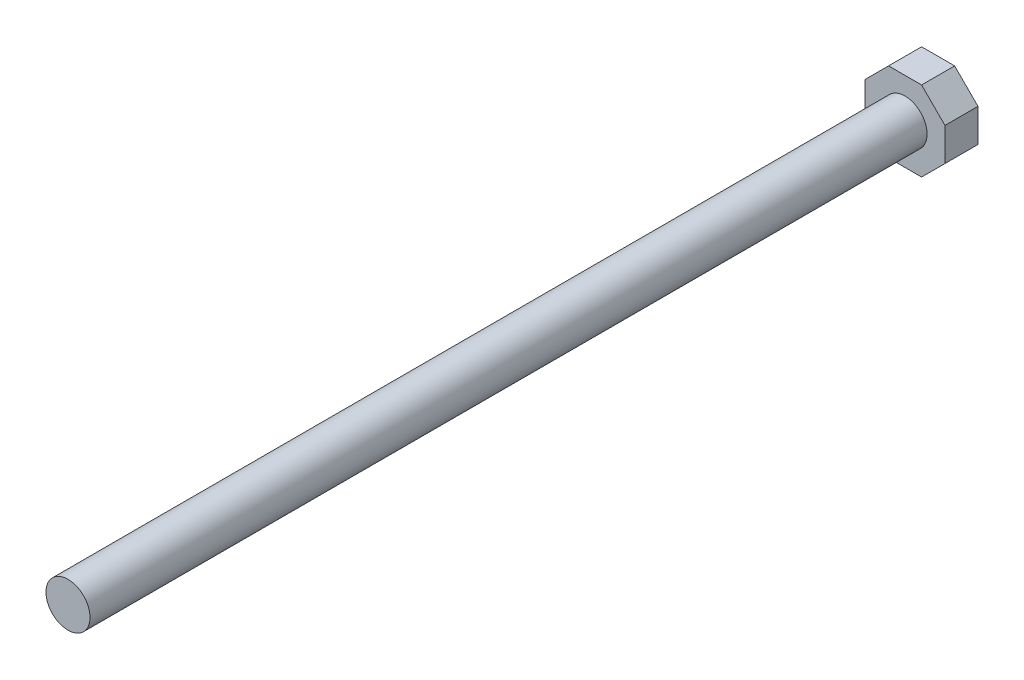
ISO-10303-21;
HEADER;
FILE_DESCRIPTION(('STEP AP214'),'2;1');
FILE_NAME('part.step','',(''),(''),'','','');
FILE_SCHEMA(('AUTOMOTIVE_DESIGN { 1 0 10303 214 1 1 1 1 }'));
ENDSEC;
DATA;
#1=APPLICATION_CONTEXT('core data for automotive mechanical design processes');
#2=APPLICATION_PROTOCOL_DEFINITION('international standard','automotive_design',2000,#1);
#3=PRODUCT_CONTEXT('',#1,'mechanical');
#4=PRODUCT('Part','Part','',(#3));
#5=PRODUCT_RELATED_PRODUCT_CATEGORY('part','',(#4));
#6=PRODUCT_DEFINITION_FORMATION('','',#4);
#7=PRODUCT_DEFINITION_CONTEXT('part definition',#1,'design');
#8=PRODUCT_DEFINITION('design','',#6,#7);
#9=PRODUCT_DEFINITION_SHAPE('','',#8);
#10=(LENGTH_UNIT() NAMED_UNIT(*) SI_UNIT(.MILLI.,.METRE.));
#11=(NAMED_UNIT(*) PLANE_ANGLE_UNIT() SI_UNIT($,.RADIAN.));
#12=(NAMED_UNIT(*) SI_UNIT($,.STERADIAN.) SOLID_ANGLE_UNIT());
#13=UNCERTAINTY_MEASURE_WITH_UNIT(LENGTH_MEASURE(1.E-05),#10,'distance_accuracy_value','');
#14=(GEOMETRIC_REPRESENTATION_CONTEXT(3) GLOBAL_UNCERTAINTY_ASSIGNED_CONTEXT((#13)) GLOBAL_UNIT_ASSIGNED_CONTEXT((#10,
#11,#12)) REPRESENTATION_CONTEXT('',''));
#15=CARTESIAN_POINT('',(0.,0.,0.));
#16=DIRECTION('',(0.,0.,1.));
#17=DIRECTION('',(1.,0.,0.));
#18=AXIS2_PLACEMENT_3D('',#15,#16,#17);
#19=CARTESIAN_POINT('',(-1.77703987317861,-2.71481784594583,3.));
#20=DIRECTION('',(1.,0.,0.));
#21=DIRECTION('',(0.,0.,-1.));
#22=AXIS2_PLACEMENT_3D('',#19,#20,#21);
#23=PLANE('',#22);
#24=DIRECTION('',(0.,-1.,0.));
#25=VECTOR('',#24,1.);
#26=CARTESIAN_POINT('',(-1.77703987317861,-2.71481784594583,0.));
#27=LINE('',#26,#25);
#28=CARTESIAN_POINT('',(-1.77703987317861,0.28518215405417,0.));
#29=VERTEX_POINT('',#28);
#30=CARTESIAN_POINT('',(-1.77703987317861,-2.71481784594583,0.));
#31=VERTEX_POINT('',#30);
#32=EDGE_CURVE('E131',#29,#31,#27,.T.);
#33=ORIENTED_EDGE('',*,*,#32,.T.);
#34=DIRECTION('',(0.,0.,-1.));
#35=VECTOR('',#34,1.);
#36=CARTESIAN_POINT('',(-1.77703987317861,-2.71481784594583,3.));
#37=LINE('',#36,#35);
#38=CARTESIAN_POINT('',(-1.77703987317861,-2.71481784594583,3.));
#39=VERTEX_POINT('',#38);
#40=EDGE_CURVE('E36',#39,#31,#37,.T.);
#41=ORIENTED_EDGE('',*,*,#40,.F.);
#42=DIRECTION('',(0.,-1.,0.));
#43=VECTOR('',#42,1.);
#44=CARTESIAN_POINT('',(-1.77703987317861,-2.71481784594583,3.));
#45=LINE('',#44,#43);
#46=CARTESIAN_POINT('',(-1.77703987317861,0.28518215405417,3.));
#47=VERTEX_POINT('',#46);
#48=EDGE_CURVE('E146',#47,#39,#45,.T.);
#49=ORIENTED_EDGE('',*,*,#48,.F.);
#50=DIRECTION('',(0.,0.,-1.));
#51=VECTOR('',#50,1.);
#52=CARTESIAN_POINT('',(-1.77703987317861,0.28518215405417,3.));
#53=LINE('',#52,#51);
#54=EDGE_CURVE('E127',#47,#29,#53,.T.);
#55=ORIENTED_EDGE('',*,*,#54,.T.);
#56=EDGE_LOOP('',(#33,#41,#49,#55));
#57=FACE_BOUND('',#56,.T.);
#58=ADVANCED_FACE('F33',(#57),#23,.F.);
#59=CARTESIAN_POINT('',(0.34428047038103,-4.83613818950547,3.));
#60=DIRECTION('',(0.707106781186547,0.707106781186547,0.));
#61=DIRECTION('',(-0.707106781186548,0.707106781186548,0.));
#62=AXIS2_PLACEMENT_3D('',#59,#60,#61);
#63=PLANE('',#62);
#64=DIRECTION('',(0.707106781186548,-0.707106781186548,0.));
#65=VECTOR('',#64,1.);
#66=CARTESIAN_POINT('',(0.34428047038103,-4.83613818950547,0.));
#67=LINE('',#66,#65);
#68=CARTESIAN_POINT('',(0.34428047038103,-4.83613818950547,0.));
#69=VERTEX_POINT('',#68);
#70=EDGE_CURVE('E134',#31,#69,#67,.T.);
#71=ORIENTED_EDGE('',*,*,#70,.T.);
#72=DIRECTION('',(0.,0.,-1.));
#73=VECTOR('',#72,1.);
#74=CARTESIAN_POINT('',(0.34428047038103,-4.83613818950547,3.));
#75=LINE('',#74,#73);
#76=CARTESIAN_POINT('',(0.34428047038103,-4.83613818950547,3.));
#77=VERTEX_POINT('',#76);
#78=EDGE_CURVE('E155',#77,#69,#75,.T.);
#79=ORIENTED_EDGE('',*,*,#78,.F.);
#80=DIRECTION('',(0.707106781186548,-0.707106781186548,0.));
#81=VECTOR('',#80,1.);
#82=CARTESIAN_POINT('',(0.34428047038103,-4.83613818950547,3.));
#83=LINE('',#82,#81);
#84=EDGE_CURVE('E94',#39,#77,#83,.T.);
#85=ORIENTED_EDGE('',*,*,#84,.F.);
#86=ORIENTED_EDGE('',*,*,#40,.T.);
#87=EDGE_LOOP('',(#71,#79,#85,#86));
#88=FACE_BOUND('',#87,.T.);
#89=ADVANCED_FACE('F161',(#88),#63,.F.);
#90=CARTESIAN_POINT('',(3.34428047038103,-4.83613818950547,3.));
#91=DIRECTION('',(0.,1.,0.));
#92=DIRECTION('',(0.,0.,1.));
#93=AXIS2_PLACEMENT_3D('',#90,#91,#92);
#94=PLANE('',#93);
#95=DIRECTION('',(1.,0.,0.));
#96=VECTOR('',#95,1.);
#97=CARTESIAN_POINT('',(3.34428047038103,-4.83613818950547,0.));
#98=LINE('',#97,#96);
#99=CARTESIAN_POINT('',(3.34428047038103,-4.83613818950547,0.));
#100=VERTEX_POINT('',#99);
#101=EDGE_CURVE('E137',#69,#100,#98,.T.);
#102=ORIENTED_EDGE('',*,*,#101,.T.);
#103=DIRECTION('',(0.,0.,-1.));
#104=VECTOR('',#103,1.);
#105=CARTESIAN_POINT('',(3.34428047038103,-4.83613818950547,3.));
#106=LINE('',#105,#104);
#107=CARTESIAN_POINT('',(3.34428047038103,-4.83613818950547,3.));
#108=VERTEX_POINT('',#107);
#109=EDGE_CURVE('E153',#108,#100,#106,.T.);
#110=ORIENTED_EDGE('',*,*,#109,.F.);
#111=DIRECTION('',(1.,0.,0.));
#112=VECTOR('',#111,1.);
#113=CARTESIAN_POINT('',(3.34428047038103,-4.83613818950547,3.));
#114=LINE('',#113,#112);
#115=EDGE_CURVE('E176',#77,#108,#114,.T.);
#116=ORIENTED_EDGE('',*,*,#115,.F.);
#117=ORIENTED_EDGE('',*,*,#78,.T.);
#118=EDGE_LOOP('',(#102,#110,#116,#117));
#119=FACE_BOUND('',#118,.T.);
#120=ADVANCED_FACE('F170',(#119),#94,.F.);
#121=CARTESIAN_POINT('',(5.46560081394067,-2.71481784594583,3.));
#122=DIRECTION('',(-0.707106781186548,0.707106781186547,0.));
#123=DIRECTION('',(-0.707106781186547,-0.707106781186548,0.));
#124=AXIS2_PLACEMENT_3D('',#121,#122,#123);
#125=PLANE('',#124);
#126=DIRECTION('',(0.707106781186547,0.707106781186548,0.));
#127=VECTOR('',#126,1.);
#128=CARTESIAN_POINT('',(5.46560081394067,-2.71481784594583,0.));
#129=LINE('',#128,#127);
#130=CARTESIAN_POINT('',(5.46560081394067,-2.71481784594583,0.));
#131=VERTEX_POINT('',#130);
#132=EDGE_CURVE('E139',#100,#131,#129,.T.);
#133=ORIENTED_EDGE('',*,*,#132,.T.);
#134=DIRECTION('',(0.,0.,-1.));
#135=VECTOR('',#134,1.);
#136=CARTESIAN_POINT('',(5.46560081394067,-2.71481784594583,3.));
#137=LINE('',#136,#135);
#138=CARTESIAN_POINT('',(5.46560081394067,-2.71481784594583,3.));
#139=VERTEX_POINT('',#138);
#140=EDGE_CURVE('E150',#139,#131,#137,.T.);
#141=ORIENTED_EDGE('',*,*,#140,.F.);
#142=DIRECTION('',(0.707106781186547,0.707106781186548,0.));
#143=VECTOR('',#142,1.);
#144=CARTESIAN_POINT('',(5.46560081394067,-2.71481784594583,3.));
#145=LINE('',#144,#143);
#146=EDGE_CURVE('E175',#108,#139,#145,.T.);
#147=ORIENTED_EDGE('',*,*,#146,.F.);
#148=ORIENTED_EDGE('',*,*,#109,.T.);
#149=EDGE_LOOP('',(#133,#141,#147,#148));
#150=FACE_BOUND('',#149,.T.);
#151=ADVANCED_FACE('F173',(#150),#125,.F.);
#152=CARTESIAN_POINT('',(5.46560081394067,0.285182154054171,3.));
#153=DIRECTION('',(-1.,0.,0.));
#154=DIRECTION('',(0.,0.,1.));
#155=AXIS2_PLACEMENT_3D('',#152,#153,#154);
#156=PLANE('',#155);
#157=DIRECTION('',(0.,1.,0.));
#158=VECTOR('',#157,1.);
#159=CARTESIAN_POINT('',(5.46560081394067,0.285182154054171,0.));
#160=LINE('',#159,#158);
#161=CARTESIAN_POINT('',(5.46560081394067,0.285182154054171,0.));
#162=VERTEX_POINT('',#161);
#163=EDGE_CURVE('E141',#131,#162,#160,.T.);
#164=ORIENTED_EDGE('',*,*,#163,.T.);
#165=DIRECTION('',(0.,0.,-1.));
#166=VECTOR('',#165,1.);
#167=CARTESIAN_POINT('',(5.46560081394067,0.285182154054171,3.));
#168=LINE('',#167,#166);
#169=CARTESIAN_POINT('',(5.46560081394067,0.285182154054171,3.));
#170=VERTEX_POINT('',#169);
#171=EDGE_CURVE('E122',#170,#162,#168,.T.);
#172=ORIENTED_EDGE('',*,*,#171,.F.);
#173=DIRECTION('',(0.,1.,0.));
#174=VECTOR('',#173,1.);
#175=CARTESIAN_POINT('',(5.46560081394067,0.285182154054171,3.));
#176=LINE('',#175,#174);
#177=EDGE_CURVE('E113',#139,#170,#176,.T.);
#178=ORIENTED_EDGE('',*,*,#177,.F.);
#179=ORIENTED_EDGE('',*,*,#140,.T.);
#180=EDGE_LOOP('',(#164,#172,#178,#179));
#181=FACE_BOUND('',#180,.T.);
#182=ADVANCED_FACE('F213',(#181),#156,.F.);
#183=CARTESIAN_POINT('',(3.34428047038103,2.40650249761381,3.));
#184=DIRECTION('',(-0.707106781186548,-0.707106781186547,0.));
#185=DIRECTION('',(0.707106781186547,-0.707106781186548,0.));
#186=AXIS2_PLACEMENT_3D('',#183,#184,#185);
#187=PLANE('',#186);
#188=DIRECTION('',(-0.707106781186547,0.707106781186548,0.));
#189=VECTOR('',#188,1.);
#190=CARTESIAN_POINT('',(3.34428047038103,2.40650249761381,0.));
#191=LINE('',#190,#189);
#192=CARTESIAN_POINT('',(3.34428047038103,2.40650249761381,0.));
#193=VERTEX_POINT('',#192);
#194=EDGE_CURVE('E121',#162,#193,#191,.T.);
#195=ORIENTED_EDGE('',*,*,#194,.T.);
#196=DIRECTION('',(0.,0.,-1.));
#197=VECTOR('',#196,1.);
#198=CARTESIAN_POINT('',(3.34428047038103,2.40650249761381,3.));
#199=LINE('',#198,#197);
#200=CARTESIAN_POINT('',(3.34428047038103,2.40650249761381,3.));
#201=VERTEX_POINT('',#200);
#202=EDGE_CURVE('E118',#201,#193,#199,.T.);
#203=ORIENTED_EDGE('',*,*,#202,.F.);
#204=DIRECTION('',(-0.707106781186547,0.707106781186548,0.));
#205=VECTOR('',#204,1.);
#206=CARTESIAN_POINT('',(3.34428047038103,2.40650249761381,3.));
#207=LINE('',#206,#205);
#208=EDGE_CURVE('E107',#170,#201,#207,.T.);
#209=ORIENTED_EDGE('',*,*,#208,.F.);
#210=ORIENTED_EDGE('',*,*,#171,.T.);
#211=EDGE_LOOP('',(#195,#203,#209,#210));
#212=FACE_BOUND('',#211,.T.);
#213=ADVANCED_FACE('F119',(#212),#187,.F.);
#214=CARTESIAN_POINT('',(0.34428047038103,2.40650249761381,3.));
#215=DIRECTION('',(0.,-1.,0.));
#216=DIRECTION('',(0.,0.,-1.));
#217=AXIS2_PLACEMENT_3D('',#214,#215,#216);
#218=PLANE('',#217);
#219=DIRECTION('',(-1.,0.,0.));
#220=VECTOR('',#219,1.);
#221=CARTESIAN_POINT('',(0.34428047038103,2.40650249761381,0.));
#222=LINE('',#221,#220);
#223=CARTESIAN_POINT('',(0.34428047038103,2.40650249761381,0.));
#224=VERTEX_POINT('',#223);
#225=EDGE_CURVE('E79',#193,#224,#222,.T.);
#226=ORIENTED_EDGE('',*,*,#225,.T.);
#227=DIRECTION('',(0.,0.,-1.));
#228=VECTOR('',#227,1.);
#229=CARTESIAN_POINT('',(0.34428047038103,2.40650249761381,3.));
#230=LINE('',#229,#228);
#231=CARTESIAN_POINT('',(0.34428047038103,2.40650249761381,3.));
#232=VERTEX_POINT('',#231);
#233=EDGE_CURVE('E123',#232,#224,#230,.T.);
#234=ORIENTED_EDGE('',*,*,#233,.F.);
#235=DIRECTION('',(-1.,0.,0.));
#236=VECTOR('',#235,1.);
#237=CARTESIAN_POINT('',(0.34428047038103,2.40650249761381,3.));
#238=LINE('',#237,#236);
#239=EDGE_CURVE('E111',#201,#232,#238,.T.);
#240=ORIENTED_EDGE('',*,*,#239,.F.);
#241=ORIENTED_EDGE('',*,*,#202,.T.);
#242=EDGE_LOOP('',(#226,#234,#240,#241));
#243=FACE_BOUND('',#242,.T.);
#244=ADVANCED_FACE('F125',(#243),#218,.F.);
#245=CARTESIAN_POINT('',(-1.77703987317861,0.28518215405417,3.));
#246=DIRECTION('',(0.707106781186548,-0.707106781186547,0.));
#247=DIRECTION('',(0.707106781186547,0.707106781186548,0.));
#248=AXIS2_PLACEMENT_3D('',#245,#246,#247);
#249=PLANE('',#248);
#250=DIRECTION('',(-0.707106781186547,-0.707106781186548,0.));
#251=VECTOR('',#250,1.);
#252=CARTESIAN_POINT('',(-1.77703987317861,0.28518215405417,0.));
#253=LINE('',#252,#251);
#254=EDGE_CURVE('E85',#224,#29,#253,.T.);
#255=ORIENTED_EDGE('',*,*,#254,.T.);
#256=ORIENTED_EDGE('',*,*,#54,.F.);
#257=DIRECTION('',(-0.707106781186547,-0.707106781186548,0.));
#258=VECTOR('',#257,1.);
#259=CARTESIAN_POINT('',(-1.77703987317861,0.28518215405417,3.));
#260=LINE('',#259,#258);
#261=EDGE_CURVE('E50',#232,#47,#260,.T.);
#262=ORIENTED_EDGE('',*,*,#261,.F.);
#263=ORIENTED_EDGE('',*,*,#233,.T.);
#264=EDGE_LOOP('',(#255,#256,#262,#263));
#265=FACE_BOUND('',#264,.T.);
#266=ADVANCED_FACE('F194',(#265),#249,.F.);
#267=CARTESIAN_POINT('',(0.,0.,3.));
#268=DIRECTION('',(0.,0.,-1.));
#269=DIRECTION('',(-1.,0.,0.));
#270=AXIS2_PLACEMENT_3D('',#267,#268,#269);
#271=PLANE('',#270);
#272=CARTESIAN_POINT('',(1.84428047038103,-1.21481784594583,3.));
#273=DIRECTION('',(0.,0.,1.));
#274=DIRECTION('',(1.,0.,0.));
#275=AXIS2_PLACEMENT_3D('',#272,#273,#274);
#276=CIRCLE('',#275,2.);
#277=CARTESIAN_POINT('',(3.84428047038103,-1.21481784594583,3.));
#278=VERTEX_POINT('',#277);
#279=EDGE_CURVE('E11',#278,#278,#276,.T.);
#280=ORIENTED_EDGE('',*,*,#279,.F.);
#281=EDGE_LOOP('',(#280));
#282=FACE_BOUND('',#281,.T.);
#283=ORIENTED_EDGE('',*,*,#48,.T.);
#284=ORIENTED_EDGE('',*,*,#84,.T.);
#285=ORIENTED_EDGE('',*,*,#115,.T.);
#286=ORIENTED_EDGE('',*,*,#146,.T.);
#287=ORIENTED_EDGE('',*,*,#177,.T.);
#288=ORIENTED_EDGE('',*,*,#208,.T.);
#289=ORIENTED_EDGE('',*,*,#239,.T.);
#290=ORIENTED_EDGE('',*,*,#261,.T.);
#291=EDGE_LOOP('',(#283,#284,#285,#286,#287,#288,#289,#290));
#292=FACE_BOUND('',#291,.T.);
#293=ADVANCED_FACE('F109',(#282,#292),#271,.F.);
#294=CARTESIAN_POINT('',(0.,0.,0.));
#295=DIRECTION('',(0.,0.,-1.));
#296=DIRECTION('',(-1.,0.,0.));
#297=AXIS2_PLACEMENT_3D('',#294,#295,#296);
#298=PLANE('',#297);
#299=ORIENTED_EDGE('',*,*,#32,.F.);
#300=ORIENTED_EDGE('',*,*,#254,.F.);
#301=ORIENTED_EDGE('',*,*,#225,.F.);
#302=ORIENTED_EDGE('',*,*,#194,.F.);
#303=ORIENTED_EDGE('',*,*,#163,.F.);
#304=ORIENTED_EDGE('',*,*,#132,.F.);
#305=ORIENTED_EDGE('',*,*,#101,.F.);
#306=ORIENTED_EDGE('',*,*,#70,.F.);
#307=EDGE_LOOP('',(#299,#300,#301,#302,#303,#304,#305,#306));
#308=FACE_BOUND('',#307,.T.);
#309=ADVANCED_FACE('F166',(#308),#298,.T.);
#310=CARTESIAN_POINT('',(1.84428047038103,-1.21481784594583,79.));
#311=DIRECTION('',(0.,0.,-1.));
#312=DIRECTION('',(-1.,0.,0.));
#313=AXIS2_PLACEMENT_3D('',#310,#311,#312);
#314=CYLINDRICAL_SURFACE('',#313,2.);
#315=CARTESIAN_POINT('',(1.84428047038103,-1.21481784594583,79.));
#316=DIRECTION('',(0.,0.,1.));
#317=DIRECTION('',(1.,0.,0.));
#318=AXIS2_PLACEMENT_3D('',#315,#316,#317);
#319=CIRCLE('',#318,2.);
#320=CARTESIAN_POINT('',(3.84428047038103,-1.21481784594583,79.));
#321=VERTEX_POINT('',#320);
#322=EDGE_CURVE('E135',#321,#321,#319,.T.);
#323=ORIENTED_EDGE('',*,*,#322,.F.);
#324=EDGE_LOOP('',(#323));
#325=FACE_BOUND('',#324,.T.);
#326=ORIENTED_EDGE('',*,*,#279,.T.);
#327=EDGE_LOOP('',(#326));
#328=FACE_BOUND('',#327,.T.);
#329=ADVANCED_FACE('F187',(#325,#328),#314,.T.);
#330=CARTESIAN_POINT('',(1.84428047038103,-1.21481784594583,79.));
#331=DIRECTION('',(0.,0.,1.));
#332=DIRECTION('',(1.,0.,0.));
#333=AXIS2_PLACEMENT_3D('',#330,#331,#332);
#334=PLANE('',#333);
#335=ORIENTED_EDGE('',*,*,#322,.T.);
#336=EDGE_LOOP('',(#335));
#337=FACE_BOUND('',#336,.T.);
#338=ADVANCED_FACE('F185',(#337),#334,.T.);
#339=CLOSED_SHELL('',(#58,#89,#120,#151,#182,#213,#244,#266,#293,#309,#329,#338));
#340=MANIFOLD_SOLID_BREP('B2',#339);
#341=ADVANCED_BREP_SHAPE_REPRESENTATION('',(#18,#340),#14);
#342=SHAPE_DEFINITION_REPRESENTATION(#9,#341);
ENDSEC;
END-ISO-10303-21;
